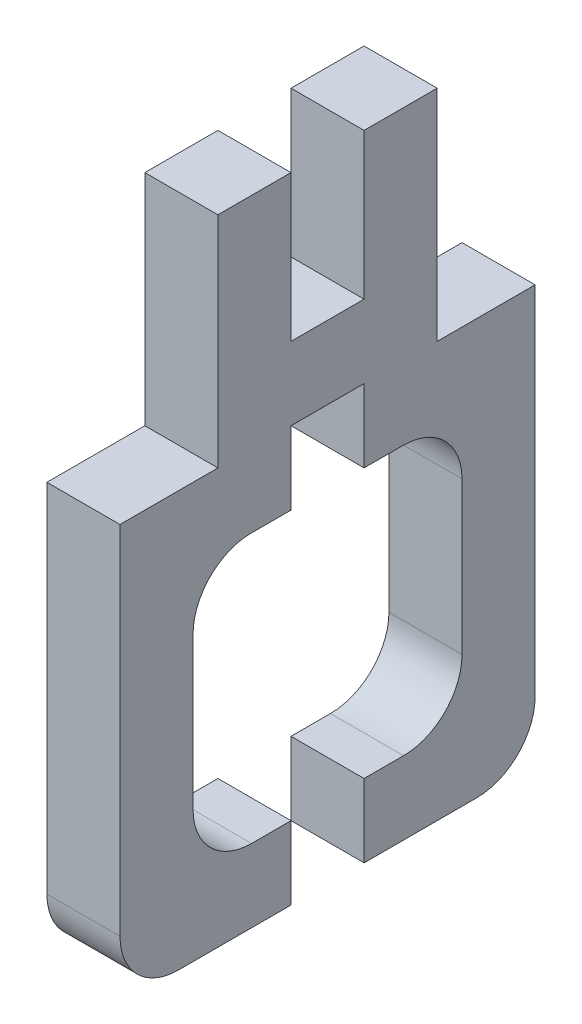
ISO-10303-21;
HEADER;
FILE_DESCRIPTION(('STEP AP214'),'2;1');
FILE_NAME('part.step','',(''),(''),'','','');
FILE_SCHEMA(('AUTOMOTIVE_DESIGN { 1 0 10303 214 1 1 1 1 }'));
ENDSEC;
DATA;
#1=APPLICATION_CONTEXT('core data for automotive mechanical design processes');
#2=APPLICATION_PROTOCOL_DEFINITION('international standard','automotive_design',2000,#1);
#3=PRODUCT_CONTEXT('',#1,'mechanical');
#4=PRODUCT('Part','Part','',(#3));
#5=PRODUCT_RELATED_PRODUCT_CATEGORY('part','',(#4));
#6=PRODUCT_DEFINITION_FORMATION('','',#4);
#7=PRODUCT_DEFINITION_CONTEXT('part definition',#1,'design');
#8=PRODUCT_DEFINITION('design','',#6,#7);
#9=PRODUCT_DEFINITION_SHAPE('','',#8);
#10=(LENGTH_UNIT() NAMED_UNIT(*) SI_UNIT(.MILLI.,.METRE.));
#11=(NAMED_UNIT(*) PLANE_ANGLE_UNIT() SI_UNIT($,.RADIAN.));
#12=(NAMED_UNIT(*) SI_UNIT($,.STERADIAN.) SOLID_ANGLE_UNIT());
#13=UNCERTAINTY_MEASURE_WITH_UNIT(LENGTH_MEASURE(1.E-05),#10,'distance_accuracy_value','');
#14=(GEOMETRIC_REPRESENTATION_CONTEXT(3) GLOBAL_UNCERTAINTY_ASSIGNED_CONTEXT((#13)) GLOBAL_UNIT_ASSIGNED_CONTEXT((#10,
#11,#12)) REPRESENTATION_CONTEXT('',''));
#15=CARTESIAN_POINT('',(0.,0.,0.));
#16=DIRECTION('',(0.,0.,1.));
#17=DIRECTION('',(1.,0.,0.));
#18=AXIS2_PLACEMENT_3D('',#15,#16,#17);
#19=CARTESIAN_POINT('',(6.35,0.,0.));
#20=DIRECTION('',(0.,0.,-1.));
#21=DIRECTION('',(0.,1.,0.));
#22=AXIS2_PLACEMENT_3D('',#19,#20,#21);
#23=PLANE('',#22);
#24=DIRECTION('',(0.,-1.,0.));
#25=VECTOR('',#24,1.);
#26=CARTESIAN_POINT('',(0.,0.,0.));
#27=LINE('',#26,#25);
#28=CARTESIAN_POINT('',(0.,36.068,0.));
#29=VERTEX_POINT('',#28);
#30=CARTESIAN_POINT('',(0.,5.08000000000004,0.));
#31=VERTEX_POINT('',#30);
#32=EDGE_CURVE('E274',#29,#31,#27,.T.);
#33=ORIENTED_EDGE('',*,*,#32,.T.);
#34=DIRECTION('',(-1.,0.,0.));
#35=VECTOR('',#34,1.);
#36=CARTESIAN_POINT('',(6.35,5.08000000000004,0.));
#37=LINE('',#36,#35);
#38=CARTESIAN_POINT('',(6.35,5.08000000000004,0.));
#39=VERTEX_POINT('',#38);
#40=EDGE_CURVE('E11',#39,#31,#37,.T.);
#41=ORIENTED_EDGE('',*,*,#40,.F.);
#42=DIRECTION('',(0.,-1.,0.));
#43=VECTOR('',#42,1.);
#44=CARTESIAN_POINT('',(6.35,0.,0.));
#45=LINE('',#44,#43);
#46=CARTESIAN_POINT('',(6.35,36.068,0.));
#47=VERTEX_POINT('',#46);
#48=EDGE_CURVE('E380',#47,#39,#45,.T.);
#49=ORIENTED_EDGE('',*,*,#48,.F.);
#50=DIRECTION('',(-1.,0.,0.));
#51=VECTOR('',#50,1.);
#52=CARTESIAN_POINT('',(6.35,36.068,0.));
#53=LINE('',#52,#51);
#54=EDGE_CURVE('E270',#47,#29,#53,.T.);
#55=ORIENTED_EDGE('',*,*,#54,.T.);
#56=EDGE_LOOP('',(#33,#41,#49,#55));
#57=FACE_BOUND('',#56,.T.);
#58=ADVANCED_FACE('F41',(#57),#23,.F.);
#59=CARTESIAN_POINT('',(6.35,5.08,-5.08));
#60=DIRECTION('',(-1.,0.,0.));
#61=DIRECTION('',(0.,0.,1.));
#62=AXIS2_PLACEMENT_3D('',#59,#60,#61);
#63=CYLINDRICAL_SURFACE('',#62,5.08);
#64=CARTESIAN_POINT('',(0.,5.08,-5.08));
#65=DIRECTION('',(1.,0.,0.));
#66=DIRECTION('',(0.,0.,-1.));
#67=AXIS2_PLACEMENT_3D('',#64,#65,#66);
#68=CIRCLE('',#67,5.08);
#69=CARTESIAN_POINT('',(0.,0.,-5.08000000000004));
#70=VERTEX_POINT('',#69);
#71=EDGE_CURVE('E278',#31,#70,#68,.T.);
#72=ORIENTED_EDGE('',*,*,#71,.T.);
#73=DIRECTION('',(-1.,0.,0.));
#74=VECTOR('',#73,1.);
#75=CARTESIAN_POINT('',(6.35,0.,-5.08000000000004));
#76=LINE('',#75,#74);
#77=CARTESIAN_POINT('',(6.35,0.,-5.08000000000004));
#78=VERTEX_POINT('',#77);
#79=EDGE_CURVE('E50',#78,#70,#76,.T.);
#80=ORIENTED_EDGE('',*,*,#79,.F.);
#81=CARTESIAN_POINT('',(6.35,5.08,-5.08));
#82=DIRECTION('',(1.,0.,0.));
#83=DIRECTION('',(0.,0.,-1.));
#84=AXIS2_PLACEMENT_3D('',#81,#82,#83);
#85=CIRCLE('',#84,5.08);
#86=EDGE_CURVE('E167',#39,#78,#85,.T.);
#87=ORIENTED_EDGE('',*,*,#86,.F.);
#88=ORIENTED_EDGE('',*,*,#40,.T.);
#89=EDGE_LOOP('',(#72,#80,#87,#88));
#90=FACE_BOUND('',#89,.T.);
#91=ADVANCED_FACE('F467',(#90),#63,.T.);
#92=CARTESIAN_POINT('',(6.35,0.,0.));
#93=DIRECTION('',(0.,-1.,0.));
#94=DIRECTION('',(0.,0.,-1.));
#95=AXIS2_PLACEMENT_3D('',#92,#93,#94);
#96=PLANE('',#95);
#97=DIRECTION('',(0.,0.,1.));
#98=VECTOR('',#97,1.);
#99=CARTESIAN_POINT('',(0.,0.,0.));
#100=LINE('',#99,#98);
#101=CARTESIAN_POINT('',(0.,0.,-14.859));
#102=VERTEX_POINT('',#101);
#103=EDGE_CURVE('E282',#102,#70,#100,.T.);
#104=ORIENTED_EDGE('',*,*,#103,.F.);
#105=DIRECTION('',(-1.,0.,0.));
#106=VECTOR('',#105,1.);
#107=CARTESIAN_POINT('',(6.35,0.,-14.859));
#108=LINE('',#107,#106);
#109=CARTESIAN_POINT('',(6.35,0.,-14.859));
#110=VERTEX_POINT('',#109);
#111=EDGE_CURVE('E458',#110,#102,#108,.T.);
#112=ORIENTED_EDGE('',*,*,#111,.F.);
#113=DIRECTION('',(0.,0.,1.));
#114=VECTOR('',#113,1.);
#115=CARTESIAN_POINT('',(6.35,0.,0.));
#116=LINE('',#115,#114);
#117=EDGE_CURVE('E466',#110,#78,#116,.T.);
#118=ORIENTED_EDGE('',*,*,#117,.T.);
#119=ORIENTED_EDGE('',*,*,#79,.T.);
#120=EDGE_LOOP('',(#104,#112,#118,#119));
#121=FACE_BOUND('',#120,.T.);
#122=ADVANCED_FACE('F464',(#121),#96,.T.);
#123=CARTESIAN_POINT('',(6.35,0.,-14.859));
#124=DIRECTION('',(0.,0.,-1.));
#125=DIRECTION('',(0.,1.,0.));
#126=AXIS2_PLACEMENT_3D('',#123,#124,#125);
#127=PLANE('',#126);
#128=DIRECTION('',(0.,-1.,0.));
#129=VECTOR('',#128,1.);
#130=CARTESIAN_POINT('',(0.,0.,-14.859));
#131=LINE('',#130,#129);
#132=CARTESIAN_POINT('',(0.,6.35,-14.859));
#133=VERTEX_POINT('',#132);
#134=EDGE_CURVE('E286',#133,#102,#131,.T.);
#135=ORIENTED_EDGE('',*,*,#134,.F.);
#136=DIRECTION('',(-1.,0.,0.));
#137=VECTOR('',#136,1.);
#138=CARTESIAN_POINT('',(6.35,6.35,-14.859));
#139=LINE('',#138,#137);
#140=CARTESIAN_POINT('',(6.35,6.35,-14.859));
#141=VERTEX_POINT('',#140);
#142=EDGE_CURVE('E455',#141,#133,#139,.T.);
#143=ORIENTED_EDGE('',*,*,#142,.F.);
#144=DIRECTION('',(0.,-1.,0.));
#145=VECTOR('',#144,1.);
#146=CARTESIAN_POINT('',(6.35,0.,-14.859));
#147=LINE('',#146,#145);
#148=EDGE_CURVE('E479',#141,#110,#147,.T.);
#149=ORIENTED_EDGE('',*,*,#148,.T.);
#150=ORIENTED_EDGE('',*,*,#111,.T.);
#151=EDGE_LOOP('',(#135,#143,#149,#150));
#152=FACE_BOUND('',#151,.T.);
#153=ADVANCED_FACE('F476',(#152),#127,.T.);
#154=CARTESIAN_POINT('',(6.35,6.35,0.));
#155=DIRECTION('',(0.,1.,0.));
#156=DIRECTION('',(0.,0.,1.));
#157=AXIS2_PLACEMENT_3D('',#154,#155,#156);
#158=PLANE('',#157);
#159=DIRECTION('',(0.,0.,-1.));
#160=VECTOR('',#159,1.);
#161=CARTESIAN_POINT('',(0.,6.35,0.));
#162=LINE('',#161,#160);
#163=CARTESIAN_POINT('',(0.,6.35,-11.43));
#164=VERTEX_POINT('',#163);
#165=EDGE_CURVE('E291',#164,#133,#162,.T.);
#166=ORIENTED_EDGE('',*,*,#165,.F.);
#167=DIRECTION('',(-1.,0.,0.));
#168=VECTOR('',#167,1.);
#169=CARTESIAN_POINT('',(6.35,6.35,-11.43));
#170=LINE('',#169,#168);
#171=CARTESIAN_POINT('',(6.35,6.35,-11.43));
#172=VERTEX_POINT('',#171);
#173=EDGE_CURVE('E452',#172,#164,#170,.T.);
#174=ORIENTED_EDGE('',*,*,#173,.F.);
#175=DIRECTION('',(0.,0.,-1.));
#176=VECTOR('',#175,1.);
#177=CARTESIAN_POINT('',(6.35,6.35,0.));
#178=LINE('',#177,#176);
#179=EDGE_CURVE('E487',#172,#141,#178,.T.);
#180=ORIENTED_EDGE('',*,*,#179,.T.);
#181=ORIENTED_EDGE('',*,*,#142,.T.);
#182=EDGE_LOOP('',(#166,#174,#180,#181));
#183=FACE_BOUND('',#182,.T.);
#184=ADVANCED_FACE('F564',(#183),#158,.T.);
#185=CARTESIAN_POINT('',(6.35,11.43,-11.43));
#186=DIRECTION('',(-1.,0.,0.));
#187=DIRECTION('',(0.,0.,1.));
#188=AXIS2_PLACEMENT_3D('',#185,#186,#187);
#189=CYLINDRICAL_SURFACE('',#188,5.08);
#190=CARTESIAN_POINT('',(0.,11.43,-11.43));
#191=DIRECTION('',(1.,0.,0.));
#192=DIRECTION('',(0.,0.,-1.));
#193=AXIS2_PLACEMENT_3D('',#190,#191,#192);
#194=CIRCLE('',#193,5.08);
#195=CARTESIAN_POINT('',(0.,11.43,-6.35));
#196=VERTEX_POINT('',#195);
#197=EDGE_CURVE('E295',#164,#196,#194,.F.);
#198=ORIENTED_EDGE('',*,*,#197,.T.);
#199=DIRECTION('',(-1.,0.,0.));
#200=VECTOR('',#199,1.);
#201=CARTESIAN_POINT('',(6.35,11.43,-6.35));
#202=LINE('',#201,#200);
#203=CARTESIAN_POINT('',(6.35,11.43,-6.35));
#204=VERTEX_POINT('',#203);
#205=EDGE_CURVE('E448',#204,#196,#202,.T.);
#206=ORIENTED_EDGE('',*,*,#205,.F.);
#207=CARTESIAN_POINT('',(6.35,11.43,-11.43));
#208=DIRECTION('',(1.,0.,0.));
#209=DIRECTION('',(0.,0.,-1.));
#210=AXIS2_PLACEMENT_3D('',#207,#208,#209);
#211=CIRCLE('',#210,5.08);
#212=EDGE_CURVE('E840',#172,#204,#211,.F.);
#213=ORIENTED_EDGE('',*,*,#212,.F.);
#214=ORIENTED_EDGE('',*,*,#173,.T.);
#215=EDGE_LOOP('',(#198,#206,#213,#214));
#216=FACE_BOUND('',#215,.T.);
#217=ADVANCED_FACE('F565',(#216),#189,.F.);
#218=CARTESIAN_POINT('',(6.35,0.,-6.35));
#219=DIRECTION('',(0.,0.,1.));
#220=DIRECTION('',(1.,0.,0.));
#221=AXIS2_PLACEMENT_3D('',#218,#219,#220);
#222=PLANE('',#221);
#223=DIRECTION('',(0.,1.,0.));
#224=VECTOR('',#223,1.);
#225=CARTESIAN_POINT('',(0.,0.,-6.35));
#226=LINE('',#225,#224);
#227=CARTESIAN_POINT('',(0.,24.638,-6.35));
#228=VERTEX_POINT('',#227);
#229=EDGE_CURVE('E299',#196,#228,#226,.T.);
#230=ORIENTED_EDGE('',*,*,#229,.T.);
#231=DIRECTION('',(-1.,0.,0.));
#232=VECTOR('',#231,1.);
#233=CARTESIAN_POINT('',(6.35,24.638,-6.35));
#234=LINE('',#233,#232);
#235=CARTESIAN_POINT('',(6.35,24.638,-6.35));
#236=VERTEX_POINT('',#235);
#237=EDGE_CURVE('E444',#236,#228,#234,.T.);
#238=ORIENTED_EDGE('',*,*,#237,.F.);
#239=DIRECTION('',(0.,1.,0.));
#240=VECTOR('',#239,1.);
#241=CARTESIAN_POINT('',(6.35,0.,-6.35));
#242=LINE('',#241,#240);
#243=EDGE_CURVE('E842',#204,#236,#242,.T.);
#244=ORIENTED_EDGE('',*,*,#243,.F.);
#245=ORIENTED_EDGE('',*,*,#205,.T.);
#246=EDGE_LOOP('',(#230,#238,#244,#245));
#247=FACE_BOUND('',#246,.T.);
#248=ADVANCED_FACE('F568',(#247),#222,.F.);
#249=CARTESIAN_POINT('',(6.35,24.638,-11.43));
#250=DIRECTION('',(-1.,0.,0.));
#251=DIRECTION('',(0.,0.,1.));
#252=AXIS2_PLACEMENT_3D('',#249,#250,#251);
#253=CYLINDRICAL_SURFACE('',#252,5.08);
#254=CARTESIAN_POINT('',(0.,24.638,-11.43));
#255=DIRECTION('',(1.,0.,0.));
#256=DIRECTION('',(0.,0.,-1.));
#257=AXIS2_PLACEMENT_3D('',#254,#255,#256);
#258=CIRCLE('',#257,5.08);
#259=CARTESIAN_POINT('',(0.,29.718,-11.43));
#260=VERTEX_POINT('',#259);
#261=EDGE_CURVE('E302',#228,#260,#258,.F.);
#262=ORIENTED_EDGE('',*,*,#261,.T.);
#263=DIRECTION('',(-1.,0.,0.));
#264=VECTOR('',#263,1.);
#265=CARTESIAN_POINT('',(6.35,29.718,-11.43));
#266=LINE('',#265,#264);
#267=CARTESIAN_POINT('',(6.35,29.718,-11.43));
#268=VERTEX_POINT('',#267);
#269=EDGE_CURVE('E441',#268,#260,#266,.T.);
#270=ORIENTED_EDGE('',*,*,#269,.F.);
#271=CARTESIAN_POINT('',(6.35,24.638,-11.43));
#272=DIRECTION('',(1.,0.,0.));
#273=DIRECTION('',(0.,0.,-1.));
#274=AXIS2_PLACEMENT_3D('',#271,#272,#273);
#275=CIRCLE('',#274,5.08);
#276=EDGE_CURVE('E847',#236,#268,#275,.F.);
#277=ORIENTED_EDGE('',*,*,#276,.F.);
#278=ORIENTED_EDGE('',*,*,#237,.T.);
#279=EDGE_LOOP('',(#262,#270,#277,#278));
#280=FACE_BOUND('',#279,.T.);
#281=ADVANCED_FACE('F572',(#280),#253,.F.);
#282=CARTESIAN_POINT('',(6.35,29.718,0.));
#283=DIRECTION('',(0.,-1.,0.));
#284=DIRECTION('',(0.,0.,-1.));
#285=AXIS2_PLACEMENT_3D('',#282,#283,#284);
#286=PLANE('',#285);
#287=DIRECTION('',(0.,0.,1.));
#288=VECTOR('',#287,1.);
#289=CARTESIAN_POINT('',(0.,29.718,0.));
#290=LINE('',#289,#288);
#291=CARTESIAN_POINT('',(0.,29.718,-14.859));
#292=VERTEX_POINT('',#291);
#293=EDGE_CURVE('E306',#292,#260,#290,.T.);
#294=ORIENTED_EDGE('',*,*,#293,.F.);
#295=DIRECTION('',(-1.,0.,0.));
#296=VECTOR('',#295,1.);
#297=CARTESIAN_POINT('',(6.35,29.718,-14.859));
#298=LINE('',#297,#296);
#299=CARTESIAN_POINT('',(6.35,29.718,-14.859));
#300=VERTEX_POINT('',#299);
#301=EDGE_CURVE('E438',#300,#292,#298,.T.);
#302=ORIENTED_EDGE('',*,*,#301,.F.);
#303=DIRECTION('',(0.,0.,1.));
#304=VECTOR('',#303,1.);
#305=CARTESIAN_POINT('',(6.35,29.718,0.));
#306=LINE('',#305,#304);
#307=EDGE_CURVE('E850',#300,#268,#306,.T.);
#308=ORIENTED_EDGE('',*,*,#307,.T.);
#309=ORIENTED_EDGE('',*,*,#269,.T.);
#310=EDGE_LOOP('',(#294,#302,#308,#309));
#311=FACE_BOUND('',#310,.T.);
#312=ADVANCED_FACE('F576',(#311),#286,.T.);
#313=CARTESIAN_POINT('',(6.35,0.,-14.859));
#314=DIRECTION('',(0.,0.,-1.));
#315=DIRECTION('',(-1.,0.,0.));
#316=AXIS2_PLACEMENT_3D('',#313,#314,#315);
#317=PLANE('',#316);
#318=DIRECTION('',(0.,-1.,0.));
#319=VECTOR('',#318,1.);
#320=CARTESIAN_POINT('',(0.,0.,-14.859));
#321=LINE('',#320,#319);
#322=CARTESIAN_POINT('',(0.,36.068,-14.859));
#323=VERTEX_POINT('',#322);
#324=EDGE_CURVE('E310',#323,#292,#321,.T.);
#325=ORIENTED_EDGE('',*,*,#324,.F.);
#326=DIRECTION('',(-1.,0.,0.));
#327=VECTOR('',#326,1.);
#328=CARTESIAN_POINT('',(6.35,36.068,-14.859));
#329=LINE('',#328,#327);
#330=CARTESIAN_POINT('',(6.35,36.068,-14.859));
#331=VERTEX_POINT('',#330);
#332=EDGE_CURVE('E435',#331,#323,#329,.T.);
#333=ORIENTED_EDGE('',*,*,#332,.F.);
#334=DIRECTION('',(0.,-1.,0.));
#335=VECTOR('',#334,1.);
#336=CARTESIAN_POINT('',(6.35,0.,-14.859));
#337=LINE('',#336,#335);
#338=EDGE_CURVE('E854',#331,#300,#337,.T.);
#339=ORIENTED_EDGE('',*,*,#338,.T.);
#340=ORIENTED_EDGE('',*,*,#301,.T.);
#341=EDGE_LOOP('',(#325,#333,#339,#340));
#342=FACE_BOUND('',#341,.T.);
#343=ADVANCED_FACE('F580',(#342),#317,.T.);
#344=CARTESIAN_POINT('',(6.35,36.068,0.));
#345=DIRECTION('',(0.,-1.,0.));
#346=DIRECTION('',(0.,0.,-1.));
#347=AXIS2_PLACEMENT_3D('',#344,#345,#346);
#348=PLANE('',#347);
#349=DIRECTION('',(0.,0.,1.));
#350=VECTOR('',#349,1.);
#351=CARTESIAN_POINT('',(0.,36.068,0.));
#352=LINE('',#351,#350);
#353=CARTESIAN_POINT('',(0.,36.068,-21.209));
#354=VERTEX_POINT('',#353);
#355=EDGE_CURVE('E314',#354,#323,#352,.T.);
#356=ORIENTED_EDGE('',*,*,#355,.F.);
#357=DIRECTION('',(-1.,0.,0.));
#358=VECTOR('',#357,1.);
#359=CARTESIAN_POINT('',(6.35,36.068,-21.209));
#360=LINE('',#359,#358);
#361=CARTESIAN_POINT('',(6.35,36.068,-21.209));
#362=VERTEX_POINT('',#361);
#363=EDGE_CURVE('E432',#362,#354,#360,.T.);
#364=ORIENTED_EDGE('',*,*,#363,.F.);
#365=DIRECTION('',(0.,0.,1.));
#366=VECTOR('',#365,1.);
#367=CARTESIAN_POINT('',(6.35,36.068,0.));
#368=LINE('',#367,#366);
#369=EDGE_CURVE('E858',#362,#331,#368,.T.);
#370=ORIENTED_EDGE('',*,*,#369,.T.);
#371=ORIENTED_EDGE('',*,*,#332,.T.);
#372=EDGE_LOOP('',(#356,#364,#370,#371));
#373=FACE_BOUND('',#372,.T.);
#374=ADVANCED_FACE('F584',(#373),#348,.T.);
#375=CARTESIAN_POINT('',(6.35,0.,-21.209));
#376=DIRECTION('',(0.,0.,1.));
#377=DIRECTION('',(1.,0.,0.));
#378=AXIS2_PLACEMENT_3D('',#375,#376,#377);
#379=PLANE('',#378);
#380=DIRECTION('',(0.,1.,0.));
#381=VECTOR('',#380,1.);
#382=CARTESIAN_POINT('',(0.,0.,-21.209));
#383=LINE('',#382,#381);
#384=CARTESIAN_POINT('',(0.,29.718,-21.209));
#385=VERTEX_POINT('',#384);
#386=EDGE_CURVE('E318',#385,#354,#383,.T.);
#387=ORIENTED_EDGE('',*,*,#386,.F.);
#388=DIRECTION('',(-1.,0.,0.));
#389=VECTOR('',#388,1.);
#390=CARTESIAN_POINT('',(6.35,29.718,-21.209));
#391=LINE('',#390,#389);
#392=CARTESIAN_POINT('',(6.35,29.718,-21.209));
#393=VERTEX_POINT('',#392);
#394=EDGE_CURVE('E429',#393,#385,#391,.T.);
#395=ORIENTED_EDGE('',*,*,#394,.F.);
#396=DIRECTION('',(0.,1.,0.));
#397=VECTOR('',#396,1.);
#398=CARTESIAN_POINT('',(6.35,0.,-21.209));
#399=LINE('',#398,#397);
#400=EDGE_CURVE('E862',#393,#362,#399,.T.);
#401=ORIENTED_EDGE('',*,*,#400,.T.);
#402=ORIENTED_EDGE('',*,*,#363,.T.);
#403=EDGE_LOOP('',(#387,#395,#401,#402));
#404=FACE_BOUND('',#403,.T.);
#405=ADVANCED_FACE('F588',(#404),#379,.T.);
#406=CARTESIAN_POINT('',(6.35,29.718,0.));
#407=DIRECTION('',(0.,-1.,0.));
#408=DIRECTION('',(0.,0.,-1.));
#409=AXIS2_PLACEMENT_3D('',#406,#407,#408);
#410=PLANE('',#409);
#411=DIRECTION('',(0.,0.,1.));
#412=VECTOR('',#411,1.);
#413=CARTESIAN_POINT('',(0.,29.718,0.));
#414=LINE('',#413,#412);
#415=CARTESIAN_POINT('',(0.,29.718,-24.638));
#416=VERTEX_POINT('',#415);
#417=EDGE_CURVE('E322',#416,#385,#414,.T.);
#418=ORIENTED_EDGE('',*,*,#417,.F.);
#419=DIRECTION('',(-1.,0.,0.));
#420=VECTOR('',#419,1.);
#421=CARTESIAN_POINT('',(6.35,29.718,-24.638));
#422=LINE('',#421,#420);
#423=CARTESIAN_POINT('',(6.35,29.718,-24.638));
#424=VERTEX_POINT('',#423);
#425=EDGE_CURVE('E426',#424,#416,#422,.T.);
#426=ORIENTED_EDGE('',*,*,#425,.F.);
#427=DIRECTION('',(0.,0.,1.));
#428=VECTOR('',#427,1.);
#429=CARTESIAN_POINT('',(6.35,29.718,0.));
#430=LINE('',#429,#428);
#431=EDGE_CURVE('E866',#424,#393,#430,.T.);
#432=ORIENTED_EDGE('',*,*,#431,.T.);
#433=ORIENTED_EDGE('',*,*,#394,.T.);
#434=EDGE_LOOP('',(#418,#426,#432,#433));
#435=FACE_BOUND('',#434,.T.);
#436=ADVANCED_FACE('F592',(#435),#410,.T.);
#437=CARTESIAN_POINT('',(6.35,24.638,-24.638));
#438=DIRECTION('',(-1.,0.,0.));
#439=DIRECTION('',(0.,0.,1.));
#440=AXIS2_PLACEMENT_3D('',#437,#438,#439);
#441=CYLINDRICAL_SURFACE('',#440,5.08);
#442=CARTESIAN_POINT('',(0.,24.638,-24.638));
#443=DIRECTION('',(1.,0.,0.));
#444=DIRECTION('',(0.,0.,-1.));
#445=AXIS2_PLACEMENT_3D('',#442,#443,#444);
#446=CIRCLE('',#445,5.08);
#447=CARTESIAN_POINT('',(0.,24.638,-29.718));
#448=VERTEX_POINT('',#447);
#449=EDGE_CURVE('E326',#416,#448,#446,.F.);
#450=ORIENTED_EDGE('',*,*,#449,.T.);
#451=DIRECTION('',(-1.,0.,0.));
#452=VECTOR('',#451,1.);
#453=CARTESIAN_POINT('',(6.35,24.638,-29.718));
#454=LINE('',#453,#452);
#455=CARTESIAN_POINT('',(6.35,24.638,-29.718));
#456=VERTEX_POINT('',#455);
#457=EDGE_CURVE('E423',#456,#448,#454,.T.);
#458=ORIENTED_EDGE('',*,*,#457,.F.);
#459=CARTESIAN_POINT('',(6.35,24.638,-24.638));
#460=DIRECTION('',(1.,0.,0.));
#461=DIRECTION('',(0.,0.,-1.));
#462=AXIS2_PLACEMENT_3D('',#459,#460,#461);
#463=CIRCLE('',#462,5.08);
#464=EDGE_CURVE('E870',#424,#456,#463,.F.);
#465=ORIENTED_EDGE('',*,*,#464,.F.);
#466=ORIENTED_EDGE('',*,*,#425,.T.);
#467=EDGE_LOOP('',(#450,#458,#465,#466));
#468=FACE_BOUND('',#467,.T.);
#469=ADVANCED_FACE('F596',(#468),#441,.F.);
#470=CARTESIAN_POINT('',(6.35,0.,-29.718));
#471=DIRECTION('',(0.,0.,1.));
#472=DIRECTION('',(1.,0.,0.));
#473=AXIS2_PLACEMENT_3D('',#470,#471,#472);
#474=PLANE('',#473);
#475=DIRECTION('',(0.,1.,0.));
#476=VECTOR('',#475,1.);
#477=CARTESIAN_POINT('',(0.,0.,-29.718));
#478=LINE('',#477,#476);
#479=CARTESIAN_POINT('',(0.,11.43,-29.718));
#480=VERTEX_POINT('',#479);
#481=EDGE_CURVE('E330',#480,#448,#478,.T.);
#482=ORIENTED_EDGE('',*,*,#481,.F.);
#483=DIRECTION('',(-1.,0.,0.));
#484=VECTOR('',#483,1.);
#485=CARTESIAN_POINT('',(6.35,11.43,-29.718));
#486=LINE('',#485,#484);
#487=CARTESIAN_POINT('',(6.35,11.43,-29.718));
#488=VERTEX_POINT('',#487);
#489=EDGE_CURVE('E420',#488,#480,#486,.T.);
#490=ORIENTED_EDGE('',*,*,#489,.F.);
#491=DIRECTION('',(0.,1.,0.));
#492=VECTOR('',#491,1.);
#493=CARTESIAN_POINT('',(6.35,0.,-29.718));
#494=LINE('',#493,#492);
#495=EDGE_CURVE('E872',#488,#456,#494,.T.);
#496=ORIENTED_EDGE('',*,*,#495,.T.);
#497=ORIENTED_EDGE('',*,*,#457,.T.);
#498=EDGE_LOOP('',(#482,#490,#496,#497));
#499=FACE_BOUND('',#498,.T.);
#500=ADVANCED_FACE('F600',(#499),#474,.T.);
#501=CARTESIAN_POINT('',(6.35,11.43,-24.638));
#502=DIRECTION('',(-1.,0.,0.));
#503=DIRECTION('',(0.,0.,1.));
#504=AXIS2_PLACEMENT_3D('',#501,#502,#503);
#505=CYLINDRICAL_SURFACE('',#504,5.08);
#506=CARTESIAN_POINT('',(0.,11.43,-24.638));
#507=DIRECTION('',(1.,0.,0.));
#508=DIRECTION('',(0.,0.,-1.));
#509=AXIS2_PLACEMENT_3D('',#506,#507,#508);
#510=CIRCLE('',#509,5.08);
#511=CARTESIAN_POINT('',(0.,6.35,-24.638));
#512=VERTEX_POINT('',#511);
#513=EDGE_CURVE('E334',#512,#480,#510,.T.);
#514=ORIENTED_EDGE('',*,*,#513,.F.);
#515=DIRECTION('',(-1.,0.,0.));
#516=VECTOR('',#515,1.);
#517=CARTESIAN_POINT('',(6.35,6.35,-24.638));
#518=LINE('',#517,#516);
#519=CARTESIAN_POINT('',(6.35,6.35,-24.638));
#520=VERTEX_POINT('',#519);
#521=EDGE_CURVE('E417',#520,#512,#518,.T.);
#522=ORIENTED_EDGE('',*,*,#521,.F.);
#523=CARTESIAN_POINT('',(6.35,11.43,-24.638));
#524=DIRECTION('',(1.,0.,0.));
#525=DIRECTION('',(0.,0.,-1.));
#526=AXIS2_PLACEMENT_3D('',#523,#524,#525);
#527=CIRCLE('',#526,5.08);
#528=EDGE_CURVE('E508',#520,#488,#527,.T.);
#529=ORIENTED_EDGE('',*,*,#528,.T.);
#530=ORIENTED_EDGE('',*,*,#489,.T.);
#531=EDGE_LOOP('',(#514,#522,#529,#530));
#532=FACE_BOUND('',#531,.T.);
#533=ADVANCED_FACE('F604',(#532),#505,.F.);
#534=CARTESIAN_POINT('',(0.,6.35,-21.209));
#535=VERTEX_POINT('',#534);
#536=EDGE_CURVE('E296',#535,#512,#162,.T.);
#537=ORIENTED_EDGE('',*,*,#536,.F.);
#538=DIRECTION('',(-1.,0.,0.));
#539=VECTOR('',#538,1.);
#540=CARTESIAN_POINT('',(6.35,6.35,-21.209));
#541=LINE('',#540,#539);
#542=CARTESIAN_POINT('',(6.35,6.35,-21.209));
#543=VERTEX_POINT('',#542);
#544=EDGE_CURVE('E414',#543,#535,#541,.T.);
#545=ORIENTED_EDGE('',*,*,#544,.F.);
#546=EDGE_CURVE('E501',#543,#520,#178,.T.);
#547=ORIENTED_EDGE('',*,*,#546,.T.);
#548=ORIENTED_EDGE('',*,*,#521,.T.);
#549=EDGE_LOOP('',(#537,#545,#547,#548));
#550=FACE_BOUND('',#549,.T.);
#551=ADVANCED_FACE('F608',(#550),#158,.T.);
#552=CARTESIAN_POINT('',(6.35,0.,-21.209));
#553=DIRECTION('',(0.,0.,-1.));
#554=DIRECTION('',(-1.,0.,0.));
#555=AXIS2_PLACEMENT_3D('',#552,#553,#554);
#556=PLANE('',#555);
#557=DIRECTION('',(0.,-1.,0.));
#558=VECTOR('',#557,1.);
#559=CARTESIAN_POINT('',(0.,0.,-21.209));
#560=LINE('',#559,#558);
#561=CARTESIAN_POINT('',(0.,0.,-21.209));
#562=VERTEX_POINT('',#561);
#563=EDGE_CURVE('E338',#535,#562,#560,.T.);
#564=ORIENTED_EDGE('',*,*,#563,.T.);
#565=DIRECTION('',(-1.,0.,0.));
#566=VECTOR('',#565,1.);
#567=CARTESIAN_POINT('',(6.35,0.,-21.209));
#568=LINE('',#567,#566);
#569=CARTESIAN_POINT('',(6.35,0.,-21.209));
#570=VERTEX_POINT('',#569);
#571=EDGE_CURVE('E411',#570,#562,#568,.T.);
#572=ORIENTED_EDGE('',*,*,#571,.F.);
#573=DIRECTION('',(0.,-1.,0.));
#574=VECTOR('',#573,1.);
#575=CARTESIAN_POINT('',(6.35,0.,-21.209));
#576=LINE('',#575,#574);
#577=EDGE_CURVE('E493',#543,#570,#576,.T.);
#578=ORIENTED_EDGE('',*,*,#577,.F.);
#579=ORIENTED_EDGE('',*,*,#544,.T.);
#580=EDGE_LOOP('',(#564,#572,#578,#579));
#581=FACE_BOUND('',#580,.T.);
#582=ADVANCED_FACE('F612',(#581),#556,.F.);
#583=CARTESIAN_POINT('',(0.,0.,-30.988));
#584=VERTEX_POINT('',#583);
#585=EDGE_CURVE('E287',#584,#562,#100,.T.);
#586=ORIENTED_EDGE('',*,*,#585,.F.);
#587=DIRECTION('',(-1.,0.,0.));
#588=VECTOR('',#587,1.);
#589=CARTESIAN_POINT('',(6.35,0.,-30.988));
#590=LINE('',#589,#588);
#591=CARTESIAN_POINT('',(6.35,0.,-30.988));
#592=VERTEX_POINT('',#591);
#593=EDGE_CURVE('E408',#592,#584,#590,.T.);
#594=ORIENTED_EDGE('',*,*,#593,.F.);
#595=EDGE_CURVE('E484',#592,#570,#116,.T.);
#596=ORIENTED_EDGE('',*,*,#595,.T.);
#597=ORIENTED_EDGE('',*,*,#571,.T.);
#598=EDGE_LOOP('',(#586,#594,#596,#597));
#599=FACE_BOUND('',#598,.T.);
#600=ADVANCED_FACE('F560',(#599),#96,.T.);
#601=CARTESIAN_POINT('',(6.35,5.08,-30.988));
#602=DIRECTION('',(-1.,0.,0.));
#603=DIRECTION('',(0.,0.,1.));
#604=AXIS2_PLACEMENT_3D('',#601,#602,#603);
#605=CYLINDRICAL_SURFACE('',#604,5.08);
#606=CARTESIAN_POINT('',(0.,5.08,-30.988));
#607=DIRECTION('',(1.,0.,0.));
#608=DIRECTION('',(0.,0.,-1.));
#609=AXIS2_PLACEMENT_3D('',#606,#607,#608);
#610=CIRCLE('',#609,5.08);
#611=CARTESIAN_POINT('',(0.,5.08000000000004,-36.068));
#612=VERTEX_POINT('',#611);
#613=EDGE_CURVE('E342',#612,#584,#610,.F.);
#614=ORIENTED_EDGE('',*,*,#613,.F.);
#615=DIRECTION('',(-1.,0.,0.));
#616=VECTOR('',#615,1.);
#617=CARTESIAN_POINT('',(6.35,5.08000000000004,-36.068));
#618=LINE('',#617,#616);
#619=CARTESIAN_POINT('',(6.35,5.08000000000004,-36.068));
#620=VERTEX_POINT('',#619);
#621=EDGE_CURVE('E405',#620,#612,#618,.T.);
#622=ORIENTED_EDGE('',*,*,#621,.F.);
#623=CARTESIAN_POINT('',(6.35,5.08,-30.988));
#624=DIRECTION('',(1.,0.,0.));
#625=DIRECTION('',(0.,0.,-1.));
#626=AXIS2_PLACEMENT_3D('',#623,#624,#625);
#627=CIRCLE('',#626,5.08);
#628=EDGE_CURVE('E492',#620,#592,#627,.F.);
#629=ORIENTED_EDGE('',*,*,#628,.T.);
#630=ORIENTED_EDGE('',*,*,#593,.T.);
#631=EDGE_LOOP('',(#614,#622,#629,#630));
#632=FACE_BOUND('',#631,.T.);
#633=ADVANCED_FACE('F618',(#632),#605,.T.);
#634=CARTESIAN_POINT('',(6.35,0.,-36.068));
#635=DIRECTION('',(0.,0.,-1.));
#636=DIRECTION('',(-1.,0.,0.));
#637=AXIS2_PLACEMENT_3D('',#634,#635,#636);
#638=PLANE('',#637);
#639=DIRECTION('',(0.,-1.,0.));
#640=VECTOR('',#639,1.);
#641=CARTESIAN_POINT('',(0.,0.,-36.068));
#642=LINE('',#641,#640);
#643=CARTESIAN_POINT('',(0.,36.068,-36.068));
#644=VERTEX_POINT('',#643);
#645=EDGE_CURVE('E346',#644,#612,#642,.T.);
#646=ORIENTED_EDGE('',*,*,#645,.F.);
#647=DIRECTION('',(-1.,0.,0.));
#648=VECTOR('',#647,1.);
#649=CARTESIAN_POINT('',(6.35,36.068,-36.068));
#650=LINE('',#649,#648);
#651=CARTESIAN_POINT('',(6.35,36.068,-36.068));
#652=VERTEX_POINT('',#651);
#653=EDGE_CURVE('E402',#652,#644,#650,.T.);
#654=ORIENTED_EDGE('',*,*,#653,.F.);
#655=DIRECTION('',(0.,-1.,0.));
#656=VECTOR('',#655,1.);
#657=CARTESIAN_POINT('',(6.35,0.,-36.068));
#658=LINE('',#657,#656);
#659=EDGE_CURVE('E499',#652,#620,#658,.T.);
#660=ORIENTED_EDGE('',*,*,#659,.T.);
#661=ORIENTED_EDGE('',*,*,#621,.T.);
#662=EDGE_LOOP('',(#646,#654,#660,#661));
#663=FACE_BOUND('',#662,.T.);
#664=ADVANCED_FACE('F621',(#663),#638,.T.);
#665=CARTESIAN_POINT('',(6.35,36.068,0.));
#666=DIRECTION('',(0.,1.,0.));
#667=DIRECTION('',(0.,0.,1.));
#668=AXIS2_PLACEMENT_3D('',#665,#666,#667);
#669=PLANE('',#668);
#670=DIRECTION('',(0.,0.,-1.));
#671=VECTOR('',#670,1.);
#672=CARTESIAN_POINT('',(0.,36.068,0.));
#673=LINE('',#672,#671);
#674=CARTESIAN_POINT('',(0.,36.068,-27.559));
#675=VERTEX_POINT('',#674);
#676=EDGE_CURVE('E350',#675,#644,#673,.T.);
#677=ORIENTED_EDGE('',*,*,#676,.F.);
#678=DIRECTION('',(-1.,0.,0.));
#679=VECTOR('',#678,1.);
#680=CARTESIAN_POINT('',(6.35,36.068,-27.559));
#681=LINE('',#680,#679);
#682=CARTESIAN_POINT('',(6.35,36.068,-27.559));
#683=VERTEX_POINT('',#682);
#684=EDGE_CURVE('E399',#683,#675,#681,.T.);
#685=ORIENTED_EDGE('',*,*,#684,.F.);
#686=DIRECTION('',(0.,0.,-1.));
#687=VECTOR('',#686,1.);
#688=CARTESIAN_POINT('',(6.35,36.068,0.));
#689=LINE('',#688,#687);
#690=EDGE_CURVE('E516',#683,#652,#689,.T.);
#691=ORIENTED_EDGE('',*,*,#690,.T.);
#692=ORIENTED_EDGE('',*,*,#653,.T.);
#693=EDGE_LOOP('',(#677,#685,#691,#692));
#694=FACE_BOUND('',#693,.T.);
#695=ADVANCED_FACE('F625',(#694),#669,.T.);
#696=CARTESIAN_POINT('',(6.35,0.,-27.559));
#697=DIRECTION('',(0.,0.,-1.));
#698=DIRECTION('',(-1.,0.,0.));
#699=AXIS2_PLACEMENT_3D('',#696,#697,#698);
#700=PLANE('',#699);
#701=DIRECTION('',(0.,-1.,0.));
#702=VECTOR('',#701,1.);
#703=CARTESIAN_POINT('',(0.,0.,-27.559));
#704=LINE('',#703,#702);
#705=CARTESIAN_POINT('',(0.,55.118,-27.559));
#706=VERTEX_POINT('',#705);
#707=EDGE_CURVE('E354',#706,#675,#704,.T.);
#708=ORIENTED_EDGE('',*,*,#707,.F.);
#709=DIRECTION('',(-1.,0.,0.));
#710=VECTOR('',#709,1.);
#711=CARTESIAN_POINT('',(6.35,55.118,-27.559));
#712=LINE('',#711,#710);
#713=CARTESIAN_POINT('',(6.35,55.118,-27.559));
#714=VERTEX_POINT('',#713);
#715=EDGE_CURVE('E396',#714,#706,#712,.T.);
#716=ORIENTED_EDGE('',*,*,#715,.F.);
#717=DIRECTION('',(0.,-1.,0.));
#718=VECTOR('',#717,1.);
#719=CARTESIAN_POINT('',(6.35,0.,-27.559));
#720=LINE('',#719,#718);
#721=EDGE_CURVE('E520',#714,#683,#720,.T.);
#722=ORIENTED_EDGE('',*,*,#721,.T.);
#723=ORIENTED_EDGE('',*,*,#684,.T.);
#724=EDGE_LOOP('',(#708,#716,#722,#723));
#725=FACE_BOUND('',#724,.T.);
#726=ADVANCED_FACE('F629',(#725),#700,.T.);
#727=CARTESIAN_POINT('',(6.35,55.118,0.));
#728=DIRECTION('',(0.,1.,0.));
#729=DIRECTION('',(0.,0.,1.));
#730=AXIS2_PLACEMENT_3D('',#727,#728,#729);
#731=PLANE('',#730);
#732=DIRECTION('',(0.,0.,-1.));
#733=VECTOR('',#732,1.);
#734=CARTESIAN_POINT('',(0.,55.118,0.));
#735=LINE('',#734,#733);
#736=CARTESIAN_POINT('',(0.,55.118,-21.209));
#737=VERTEX_POINT('',#736);
#738=EDGE_CURVE('E358',#737,#706,#735,.T.);
#739=ORIENTED_EDGE('',*,*,#738,.F.);
#740=DIRECTION('',(-1.,0.,0.));
#741=VECTOR('',#740,1.);
#742=CARTESIAN_POINT('',(6.35,55.118,-21.209));
#743=LINE('',#742,#741);
#744=CARTESIAN_POINT('',(6.35,55.118,-21.209));
#745=VERTEX_POINT('',#744);
#746=EDGE_CURVE('E393',#745,#737,#743,.T.);
#747=ORIENTED_EDGE('',*,*,#746,.F.);
#748=DIRECTION('',(0.,0.,-1.));
#749=VECTOR('',#748,1.);
#750=CARTESIAN_POINT('',(6.35,55.118,0.));
#751=LINE('',#750,#749);
#752=EDGE_CURVE('E524',#745,#714,#751,.T.);
#753=ORIENTED_EDGE('',*,*,#752,.T.);
#754=ORIENTED_EDGE('',*,*,#715,.T.);
#755=EDGE_LOOP('',(#739,#747,#753,#754));
#756=FACE_BOUND('',#755,.T.);
#757=ADVANCED_FACE('F633',(#756),#731,.T.);
#758=CARTESIAN_POINT('',(6.35,0.,-21.209));
#759=DIRECTION('',(0.,0.,1.));
#760=DIRECTION('',(0.,-1.,0.));
#761=AXIS2_PLACEMENT_3D('',#758,#759,#760);
#762=PLANE('',#761);
#763=DIRECTION('',(0.,1.,0.));
#764=VECTOR('',#763,1.);
#765=CARTESIAN_POINT('',(0.,0.,-21.209));
#766=LINE('',#765,#764);
#767=CARTESIAN_POINT('',(0.,42.418,-21.209));
#768=VERTEX_POINT('',#767);
#769=EDGE_CURVE('E362',#768,#737,#766,.T.);
#770=ORIENTED_EDGE('',*,*,#769,.F.);
#771=DIRECTION('',(-1.,0.,0.));
#772=VECTOR('',#771,1.);
#773=CARTESIAN_POINT('',(6.35,42.418,-21.209));
#774=LINE('',#773,#772);
#775=CARTESIAN_POINT('',(6.35,42.418,-21.209));
#776=VERTEX_POINT('',#775);
#777=EDGE_CURVE('E390',#776,#768,#774,.T.);
#778=ORIENTED_EDGE('',*,*,#777,.F.);
#779=DIRECTION('',(0.,1.,0.));
#780=VECTOR('',#779,1.);
#781=CARTESIAN_POINT('',(6.35,0.,-21.209));
#782=LINE('',#781,#780);
#783=EDGE_CURVE('E528',#776,#745,#782,.T.);
#784=ORIENTED_EDGE('',*,*,#783,.T.);
#785=ORIENTED_EDGE('',*,*,#746,.T.);
#786=EDGE_LOOP('',(#770,#778,#784,#785));
#787=FACE_BOUND('',#786,.T.);
#788=ADVANCED_FACE('F637',(#787),#762,.T.);
#789=CARTESIAN_POINT('',(6.35,42.418,0.));
#790=DIRECTION('',(0.,1.,0.));
#791=DIRECTION('',(0.,0.,1.));
#792=AXIS2_PLACEMENT_3D('',#789,#790,#791);
#793=PLANE('',#792);
#794=DIRECTION('',(0.,0.,-1.));
#795=VECTOR('',#794,1.);
#796=CARTESIAN_POINT('',(0.,42.418,0.));
#797=LINE('',#796,#795);
#798=CARTESIAN_POINT('',(0.,42.418,-14.859));
#799=VERTEX_POINT('',#798);
#800=EDGE_CURVE('E366',#799,#768,#797,.T.);
#801=ORIENTED_EDGE('',*,*,#800,.F.);
#802=DIRECTION('',(-1.,0.,0.));
#803=VECTOR('',#802,1.);
#804=CARTESIAN_POINT('',(6.35,42.418,-14.859));
#805=LINE('',#804,#803);
#806=CARTESIAN_POINT('',(6.35,42.418,-14.859));
#807=VERTEX_POINT('',#806);
#808=EDGE_CURVE('E387',#807,#799,#805,.T.);
#809=ORIENTED_EDGE('',*,*,#808,.F.);
#810=DIRECTION('',(0.,0.,-1.));
#811=VECTOR('',#810,1.);
#812=CARTESIAN_POINT('',(6.35,42.418,0.));
#813=LINE('',#812,#811);
#814=EDGE_CURVE('E532',#807,#776,#813,.T.);
#815=ORIENTED_EDGE('',*,*,#814,.T.);
#816=ORIENTED_EDGE('',*,*,#777,.T.);
#817=EDGE_LOOP('',(#801,#809,#815,#816));
#818=FACE_BOUND('',#817,.T.);
#819=ADVANCED_FACE('F641',(#818),#793,.T.);
#820=CARTESIAN_POINT('',(6.35,0.,-14.859));
#821=DIRECTION('',(0.,0.,-1.));
#822=DIRECTION('',(0.,1.,0.));
#823=AXIS2_PLACEMENT_3D('',#820,#821,#822);
#824=PLANE('',#823);
#825=DIRECTION('',(0.,-1.,0.));
#826=VECTOR('',#825,1.);
#827=CARTESIAN_POINT('',(0.,0.,-14.859));
#828=LINE('',#827,#826);
#829=CARTESIAN_POINT('',(0.,55.118,-14.859));
#830=VERTEX_POINT('',#829);
#831=EDGE_CURVE('E370',#830,#799,#828,.T.);
#832=ORIENTED_EDGE('',*,*,#831,.F.);
#833=DIRECTION('',(-1.,0.,0.));
#834=VECTOR('',#833,1.);
#835=CARTESIAN_POINT('',(6.35,55.118,-14.859));
#836=LINE('',#835,#834);
#837=CARTESIAN_POINT('',(6.35,55.118,-14.859));
#838=VERTEX_POINT('',#837);
#839=EDGE_CURVE('E263',#838,#830,#836,.T.);
#840=ORIENTED_EDGE('',*,*,#839,.F.);
#841=DIRECTION('',(0.,-1.,0.));
#842=VECTOR('',#841,1.);
#843=CARTESIAN_POINT('',(6.35,0.,-14.859));
#844=LINE('',#843,#842);
#845=EDGE_CURVE('E254',#838,#807,#844,.T.);
#846=ORIENTED_EDGE('',*,*,#845,.T.);
#847=ORIENTED_EDGE('',*,*,#808,.T.);
#848=EDGE_LOOP('',(#832,#840,#846,#847));
#849=FACE_BOUND('',#848,.T.);
#850=ADVANCED_FACE('F538',(#849),#824,.T.);
#851=CARTESIAN_POINT('',(6.35,55.118,0.));
#852=DIRECTION('',(0.,-1.,0.));
#853=DIRECTION('',(0.,0.,-1.));
#854=AXIS2_PLACEMENT_3D('',#851,#852,#853);
#855=PLANE('',#854);
#856=DIRECTION('',(0.,0.,1.));
#857=VECTOR('',#856,1.);
#858=CARTESIAN_POINT('',(0.,55.118,0.));
#859=LINE('',#858,#857);
#860=CARTESIAN_POINT('',(0.,55.118,-8.509));
#861=VERTEX_POINT('',#860);
#862=EDGE_CURVE('E261',#830,#861,#859,.T.);
#863=ORIENTED_EDGE('',*,*,#862,.T.);
#864=DIRECTION('',(-1.,0.,0.));
#865=VECTOR('',#864,1.);
#866=CARTESIAN_POINT('',(6.35,55.118,-8.509));
#867=LINE('',#866,#865);
#868=CARTESIAN_POINT('',(6.35,55.118,-8.509));
#869=VERTEX_POINT('',#868);
#870=EDGE_CURVE('E258',#869,#861,#867,.T.);
#871=ORIENTED_EDGE('',*,*,#870,.F.);
#872=DIRECTION('',(0.,0.,1.));
#873=VECTOR('',#872,1.);
#874=CARTESIAN_POINT('',(6.35,55.118,0.));
#875=LINE('',#874,#873);
#876=EDGE_CURVE('E247',#838,#869,#875,.T.);
#877=ORIENTED_EDGE('',*,*,#876,.F.);
#878=ORIENTED_EDGE('',*,*,#839,.T.);
#879=EDGE_LOOP('',(#863,#871,#877,#878));
#880=FACE_BOUND('',#879,.T.);
#881=ADVANCED_FACE('F259',(#880),#855,.F.);
#882=CARTESIAN_POINT('',(6.35,0.,-8.509));
#883=DIRECTION('',(0.,0.,-1.));
#884=DIRECTION('',(0.,1.,0.));
#885=AXIS2_PLACEMENT_3D('',#882,#883,#884);
#886=PLANE('',#885);
#887=DIRECTION('',(0.,-1.,0.));
#888=VECTOR('',#887,1.);
#889=CARTESIAN_POINT('',(0.,0.,-8.509));
#890=LINE('',#889,#888);
#891=CARTESIAN_POINT('',(0.,36.068,-8.509));
#892=VERTEX_POINT('',#891);
#893=EDGE_CURVE('E153',#861,#892,#890,.T.);
#894=ORIENTED_EDGE('',*,*,#893,.T.);
#895=DIRECTION('',(-1.,0.,0.));
#896=VECTOR('',#895,1.);
#897=CARTESIAN_POINT('',(6.35,36.068,-8.509));
#898=LINE('',#897,#896);
#899=CARTESIAN_POINT('',(6.35,36.068,-8.509));
#900=VERTEX_POINT('',#899);
#901=EDGE_CURVE('E264',#900,#892,#898,.T.);
#902=ORIENTED_EDGE('',*,*,#901,.F.);
#903=DIRECTION('',(0.,-1.,0.));
#904=VECTOR('',#903,1.);
#905=CARTESIAN_POINT('',(6.35,0.,-8.509));
#906=LINE('',#905,#904);
#907=EDGE_CURVE('E251',#869,#900,#906,.T.);
#908=ORIENTED_EDGE('',*,*,#907,.F.);
#909=ORIENTED_EDGE('',*,*,#870,.T.);
#910=EDGE_LOOP('',(#894,#902,#908,#909));
#911=FACE_BOUND('',#910,.T.);
#912=ADVANCED_FACE('F266',(#911),#886,.F.);
#913=CARTESIAN_POINT('',(6.35,36.068,0.));
#914=DIRECTION('',(0.,-1.,0.));
#915=DIRECTION('',(0.,0.,-1.));
#916=AXIS2_PLACEMENT_3D('',#913,#914,#915);
#917=PLANE('',#916);
#918=DIRECTION('',(0.,0.,1.));
#919=VECTOR('',#918,1.);
#920=CARTESIAN_POINT('',(0.,36.068,0.));
#921=LINE('',#920,#919);
#922=EDGE_CURVE('E159',#892,#29,#921,.T.);
#923=ORIENTED_EDGE('',*,*,#922,.T.);
#924=ORIENTED_EDGE('',*,*,#54,.F.);
#925=DIRECTION('',(0.,0.,1.));
#926=VECTOR('',#925,1.);
#927=CARTESIAN_POINT('',(6.35,36.068,0.));
#928=LINE('',#927,#926);
#929=EDGE_CURVE('E58',#900,#47,#928,.T.);
#930=ORIENTED_EDGE('',*,*,#929,.F.);
#931=ORIENTED_EDGE('',*,*,#901,.T.);
#932=EDGE_LOOP('',(#923,#924,#930,#931));
#933=FACE_BOUND('',#932,.T.);
#934=ADVANCED_FACE('F542',(#933),#917,.F.);
#935=CARTESIAN_POINT('',(6.35,0.,0.));
#936=DIRECTION('',(1.,0.,0.));
#937=DIRECTION('',(0.,0.,-1.));
#938=AXIS2_PLACEMENT_3D('',#935,#936,#937);
#939=PLANE('',#938);
#940=ORIENTED_EDGE('',*,*,#48,.T.);
#941=ORIENTED_EDGE('',*,*,#86,.T.);
#942=ORIENTED_EDGE('',*,*,#117,.F.);
#943=ORIENTED_EDGE('',*,*,#148,.F.);
#944=ORIENTED_EDGE('',*,*,#179,.F.);
#945=ORIENTED_EDGE('',*,*,#212,.T.);
#946=ORIENTED_EDGE('',*,*,#243,.T.);
#947=ORIENTED_EDGE('',*,*,#276,.T.);
#948=ORIENTED_EDGE('',*,*,#307,.F.);
#949=ORIENTED_EDGE('',*,*,#338,.F.);
#950=ORIENTED_EDGE('',*,*,#369,.F.);
#951=ORIENTED_EDGE('',*,*,#400,.F.);
#952=ORIENTED_EDGE('',*,*,#431,.F.);
#953=ORIENTED_EDGE('',*,*,#464,.T.);
#954=ORIENTED_EDGE('',*,*,#495,.F.);
#955=ORIENTED_EDGE('',*,*,#528,.F.);
#956=ORIENTED_EDGE('',*,*,#546,.F.);
#957=ORIENTED_EDGE('',*,*,#577,.T.);
#958=ORIENTED_EDGE('',*,*,#595,.F.);
#959=ORIENTED_EDGE('',*,*,#628,.F.);
#960=ORIENTED_EDGE('',*,*,#659,.F.);
#961=ORIENTED_EDGE('',*,*,#690,.F.);
#962=ORIENTED_EDGE('',*,*,#721,.F.);
#963=ORIENTED_EDGE('',*,*,#752,.F.);
#964=ORIENTED_EDGE('',*,*,#783,.F.);
#965=ORIENTED_EDGE('',*,*,#814,.F.);
#966=ORIENTED_EDGE('',*,*,#845,.F.);
#967=ORIENTED_EDGE('',*,*,#876,.T.);
#968=ORIENTED_EDGE('',*,*,#907,.T.);
#969=ORIENTED_EDGE('',*,*,#929,.T.);
#970=EDGE_LOOP('',(#940,#941,#942,#943,#944,#945,#946,#947,#948,#949,#950,#951,#952,#953,#954,
#955,#956,#957,#958,#959,#960,#961,#962,#963,#964,#965,#966,#967,#968,#969));
#971=FACE_BOUND('',#970,.T.);
#972=ADVANCED_FACE('F249',(#971),#939,.T.);
#973=CARTESIAN_POINT('',(0.,0.,0.));
#974=DIRECTION('',(1.,0.,0.));
#975=DIRECTION('',(0.,0.,-1.));
#976=AXIS2_PLACEMENT_3D('',#973,#974,#975);
#977=PLANE('',#976);
#978=ORIENTED_EDGE('',*,*,#32,.F.);
#979=ORIENTED_EDGE('',*,*,#922,.F.);
#980=ORIENTED_EDGE('',*,*,#893,.F.);
#981=ORIENTED_EDGE('',*,*,#862,.F.);
#982=ORIENTED_EDGE('',*,*,#831,.T.);
#983=ORIENTED_EDGE('',*,*,#800,.T.);
#984=ORIENTED_EDGE('',*,*,#769,.T.);
#985=ORIENTED_EDGE('',*,*,#738,.T.);
#986=ORIENTED_EDGE('',*,*,#707,.T.);
#987=ORIENTED_EDGE('',*,*,#676,.T.);
#988=ORIENTED_EDGE('',*,*,#645,.T.);
#989=ORIENTED_EDGE('',*,*,#613,.T.);
#990=ORIENTED_EDGE('',*,*,#585,.T.);
#991=ORIENTED_EDGE('',*,*,#563,.F.);
#992=ORIENTED_EDGE('',*,*,#536,.T.);
#993=ORIENTED_EDGE('',*,*,#513,.T.);
#994=ORIENTED_EDGE('',*,*,#481,.T.);
#995=ORIENTED_EDGE('',*,*,#449,.F.);
#996=ORIENTED_EDGE('',*,*,#417,.T.);
#997=ORIENTED_EDGE('',*,*,#386,.T.);
#998=ORIENTED_EDGE('',*,*,#355,.T.);
#999=ORIENTED_EDGE('',*,*,#324,.T.);
#1000=ORIENTED_EDGE('',*,*,#293,.T.);
#1001=ORIENTED_EDGE('',*,*,#261,.F.);
#1002=ORIENTED_EDGE('',*,*,#229,.F.);
#1003=ORIENTED_EDGE('',*,*,#197,.F.);
#1004=ORIENTED_EDGE('',*,*,#165,.T.);
#1005=ORIENTED_EDGE('',*,*,#134,.T.);
#1006=ORIENTED_EDGE('',*,*,#103,.T.);
#1007=ORIENTED_EDGE('',*,*,#71,.F.);
#1008=EDGE_LOOP('',(#978,#979,#980,#981,#982,#983,#984,#985,#986,#987,#988,#989,#990,#991,#992,
#993,#994,#995,#996,#997,#998,#999,#1000,#1001,#1002,#1003,#1004,#1005,#1006,#1007));
#1009=FACE_BOUND('',#1008,.T.);
#1010=ADVANCED_FACE('F471',(#1009),#977,.F.);
#1011=CLOSED_SHELL('',(#58,#91,#122,#153,#184,#217,#248,#281,#312,#343,#374,#405,#436,#469,#500,
#533,#551,#582,#600,#633,#664,#695,#726,#757,#788,#819,#850,#881,#912,#934,#972,#1010));
#1012=MANIFOLD_SOLID_BREP('B2',#1011);
#1013=ADVANCED_BREP_SHAPE_REPRESENTATION('',(#18,#1012),#14);
#1014=SHAPE_DEFINITION_REPRESENTATION(#9,#1013);
ENDSEC;
END-ISO-10303-21;
